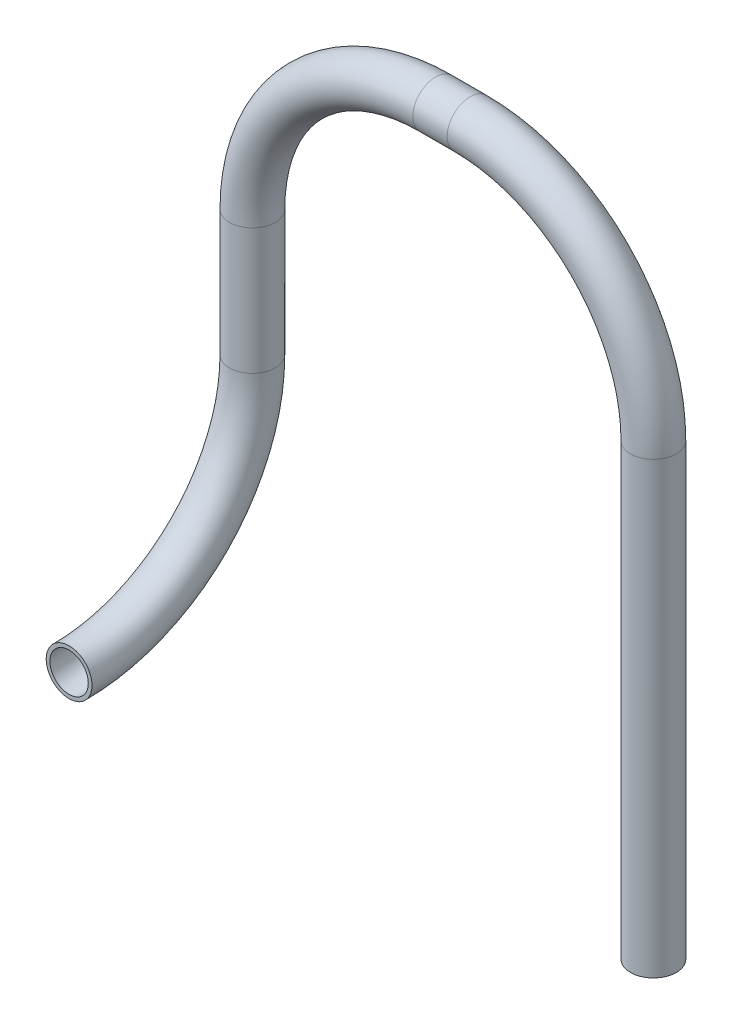
ISO-10303-21;
HEADER;
FILE_DESCRIPTION(('STEP AP214'),'2;1');
FILE_NAME('part.step','',(''),(''),'','','');
FILE_SCHEMA(('AUTOMOTIVE_DESIGN { 1 0 10303 214 1 1 1 1 }'));
ENDSEC;
DATA;
#1=APPLICATION_CONTEXT('core data for automotive mechanical design processes');
#2=APPLICATION_PROTOCOL_DEFINITION('international standard','automotive_design',2000,#1);
#3=PRODUCT_CONTEXT('',#1,'mechanical');
#4=PRODUCT('Part','Part','',(#3));
#5=PRODUCT_RELATED_PRODUCT_CATEGORY('part','',(#4));
#6=PRODUCT_DEFINITION_FORMATION('','',#4);
#7=PRODUCT_DEFINITION_CONTEXT('part definition',#1,'design');
#8=PRODUCT_DEFINITION('design','',#6,#7);
#9=PRODUCT_DEFINITION_SHAPE('','',#8);
#10=(LENGTH_UNIT() NAMED_UNIT(*) SI_UNIT(.MILLI.,.METRE.));
#11=(NAMED_UNIT(*) PLANE_ANGLE_UNIT() SI_UNIT($,.RADIAN.));
#12=(NAMED_UNIT(*) SI_UNIT($,.STERADIAN.) SOLID_ANGLE_UNIT());
#13=UNCERTAINTY_MEASURE_WITH_UNIT(LENGTH_MEASURE(1.E-05),#10,'distance_accuracy_value','');
#14=(GEOMETRIC_REPRESENTATION_CONTEXT(3) GLOBAL_UNCERTAINTY_ASSIGNED_CONTEXT((#13)) GLOBAL_UNIT_ASSIGNED_CONTEXT((#10,
#11,#12)) REPRESENTATION_CONTEXT('',''));
#15=CARTESIAN_POINT('',(0.,0.,0.));
#16=DIRECTION('',(0.,0.,1.));
#17=DIRECTION('',(1.,0.,0.));
#18=AXIS2_PLACEMENT_3D('',#15,#16,#17);
#19=CARTESIAN_POINT('',(70.,-56.4,0.));
#20=DIRECTION('',(0.,-1.,0.));
#21=DIRECTION('',(0.,0.,1.));
#22=AXIS2_PLACEMENT_3D('',#19,#20,#21);
#23=PLANE('',#22);
#24=CARTESIAN_POINT('',(70.,-56.4,0.));
#25=DIRECTION('',(0.,-1.,0.));
#26=DIRECTION('',(1.,0.,0.));
#27=AXIS2_PLACEMENT_3D('',#24,#25,#26);
#28=CIRCLE('',#27,3.35000000000001);
#29=CARTESIAN_POINT('',(73.35,-56.4,0.));
#30=VERTEX_POINT('',#29);
#31=EDGE_CURVE('E60',#30,#30,#28,.T.);
#32=ORIENTED_EDGE('',*,*,#31,.F.);
#33=EDGE_LOOP('',(#32));
#34=FACE_BOUND('',#33,.T.);
#35=CARTESIAN_POINT('',(70.,-56.4,0.));
#36=DIRECTION('',(0.,-1.,0.));
#37=DIRECTION('',(0.,0.,1.));
#38=AXIS2_PLACEMENT_3D('',#35,#36,#37);
#39=CIRCLE('',#38,4.00000000000001);
#40=CARTESIAN_POINT('',(70.,-56.4,4.00000000000001));
#41=VERTEX_POINT('',#40);
#42=EDGE_CURVE('E53',#41,#41,#39,.T.);
#43=ORIENTED_EDGE('',*,*,#42,.T.);
#44=EDGE_LOOP('',(#43));
#45=FACE_BOUND('',#44,.T.);
#46=ADVANCED_FACE('F34',(#34,#45),#23,.T.);
#47=CARTESIAN_POINT('',(70.,-56.4,0.));
#48=DIRECTION('',(0.,1.,0.));
#49=DIRECTION('',(-1.,0.,0.));
#50=AXIS2_PLACEMENT_3D('',#47,#48,#49);
#51=CYLINDRICAL_SURFACE('',#50,4.00000000000001);
#52=CARTESIAN_POINT('',(70.,22.,0.));
#53=DIRECTION('',(0.,-1.,0.));
#54=DIRECTION('',(0.,0.,1.));
#55=AXIS2_PLACEMENT_3D('',#52,#53,#54);
#56=CIRCLE('',#55,4.00000000000001);
#57=CARTESIAN_POINT('',(74.,22.,0.));
#58=VERTEX_POINT('',#57);
#59=EDGE_CURVE('E48',#58,#58,#56,.T.);
#60=ORIENTED_EDGE('',*,*,#59,.T.);
#61=EDGE_LOOP('',(#60));
#62=FACE_BOUND('',#61,.T.);
#63=ORIENTED_EDGE('',*,*,#42,.F.);
#64=EDGE_LOOP('',(#63));
#65=FACE_BOUND('',#64,.T.);
#66=ADVANCED_FACE('F121',(#62,#65),#51,.T.);
#67=CARTESIAN_POINT('',(38.,22.,0.));
#68=DIRECTION('',(0.,0.,1.));
#69=DIRECTION('',(1.,0.,0.));
#70=AXIS2_PLACEMENT_3D('',#67,#68,#69);
#71=TOROIDAL_SURFACE('',#70,32.,4.00000000000001);
#72=CARTESIAN_POINT('',(38.,54.,0.));
#73=DIRECTION('',(1.,0.,0.));
#74=DIRECTION('',(0.,0.,1.));
#75=AXIS2_PLACEMENT_3D('',#72,#73,#74);
#76=CIRCLE('',#75,4.00000000000001);
#77=CARTESIAN_POINT('',(38.,58.,0.));
#78=VERTEX_POINT('',#77);
#79=EDGE_CURVE('E44',#78,#78,#76,.T.);
#80=CARTESIAN_POINT('',(38.,22.,0.));
#81=DIRECTION('',(0.,0.,1.));
#82=DIRECTION('',(1.,0.,0.));
#83=AXIS2_PLACEMENT_3D('',#80,#81,#82);
#84=CIRCLE('',#83,36.);
#85=EDGE_CURVE('',#58,#78,#84,.T.);
#86=ORIENTED_EDGE('',*,*,#59,.F.);
#87=ORIENTED_EDGE('',*,*,#79,.T.);
#88=ORIENTED_EDGE('',*,*,#85,.T.);
#89=ORIENTED_EDGE('',*,*,#85,.F.);
#90=EDGE_LOOP('',(#86,#88,#87,#89));
#91=FACE_BOUND('',#90,.T.);
#92=ADVANCED_FACE('F118',(#91),#71,.T.);
#93=CARTESIAN_POINT('',(38.,54.,0.));
#94=DIRECTION('',(-1.,0.,0.));
#95=DIRECTION('',(0.,0.,1.));
#96=AXIS2_PLACEMENT_3D('',#93,#94,#95);
#97=CYLINDRICAL_SURFACE('',#96,4.00000000000001);
#98=CARTESIAN_POINT('',(32.,54.,0.));
#99=DIRECTION('',(1.,0.,0.));
#100=DIRECTION('',(0.,0.,1.));
#101=AXIS2_PLACEMENT_3D('',#98,#99,#100);
#102=CIRCLE('',#101,4.00000000000001);
#103=CARTESIAN_POINT('',(32.,58.,0.));
#104=VERTEX_POINT('',#103);
#105=EDGE_CURVE('E40',#104,#104,#102,.T.);
#106=ORIENTED_EDGE('',*,*,#105,.T.);
#107=EDGE_LOOP('',(#106));
#108=FACE_BOUND('',#107,.T.);
#109=ORIENTED_EDGE('',*,*,#79,.F.);
#110=EDGE_LOOP('',(#109));
#111=FACE_BOUND('',#110,.T.);
#112=ADVANCED_FACE('F112',(#108,#111),#97,.T.);
#113=CARTESIAN_POINT('',(32.,22.,0.));
#114=DIRECTION('',(0.,0.,1.));
#115=DIRECTION('',(1.,0.,0.));
#116=AXIS2_PLACEMENT_3D('',#113,#114,#115);
#117=TOROIDAL_SURFACE('',#116,32.,4.00000000000001);
#118=CARTESIAN_POINT('',(0.,22.,0.));
#119=DIRECTION('',(0.,1.,0.));
#120=DIRECTION('',(0.,0.,1.));
#121=AXIS2_PLACEMENT_3D('',#118,#119,#120);
#122=CIRCLE('',#121,4.00000000000001);
#123=CARTESIAN_POINT('',(-4.,22.,0.));
#124=VERTEX_POINT('',#123);
#125=EDGE_CURVE('E10',#124,#124,#122,.T.);
#126=CARTESIAN_POINT('',(32.,22.,0.));
#127=DIRECTION('',(0.,0.,1.));
#128=DIRECTION('',(1.,0.,0.));
#129=AXIS2_PLACEMENT_3D('',#126,#127,#128);
#130=CIRCLE('',#129,36.);
#131=EDGE_CURVE('',#104,#124,#130,.T.);
#132=ORIENTED_EDGE('',*,*,#105,.F.);
#133=ORIENTED_EDGE('',*,*,#125,.T.);
#134=ORIENTED_EDGE('',*,*,#131,.T.);
#135=ORIENTED_EDGE('',*,*,#131,.F.);
#136=EDGE_LOOP('',(#132,#134,#133,#135));
#137=FACE_BOUND('',#136,.T.);
#138=ADVANCED_FACE('F103',(#137),#117,.T.);
#139=CARTESIAN_POINT('',(0.,22.,0.));
#140=DIRECTION('',(0.,-1.,0.));
#141=DIRECTION('',(0.,0.,-1.));
#142=AXIS2_PLACEMENT_3D('',#139,#140,#141);
#143=CYLINDRICAL_SURFACE('',#142,4.00000000000001);
#144=CARTESIAN_POINT('',(0.,0.,0.));
#145=DIRECTION('',(0.,1.,0.));
#146=DIRECTION('',(0.,0.,1.));
#147=AXIS2_PLACEMENT_3D('',#144,#145,#146);
#148=CIRCLE('',#147,4.00000000000001);
#149=CARTESIAN_POINT('',(0.,0.,-4.));
#150=VERTEX_POINT('',#149);
#151=EDGE_CURVE('E64',#150,#150,#148,.T.);
#152=ORIENTED_EDGE('',*,*,#151,.T.);
#153=EDGE_LOOP('',(#152));
#154=FACE_BOUND('',#153,.T.);
#155=ORIENTED_EDGE('',*,*,#125,.F.);
#156=EDGE_LOOP('',(#155));
#157=FACE_BOUND('',#156,.T.);
#158=ADVANCED_FACE('F101',(#154,#157),#143,.T.);
#159=CARTESIAN_POINT('',(70.,-56.4,0.));
#160=DIRECTION('',(0.,1.,0.));
#161=DIRECTION('',(-1.,0.,0.));
#162=AXIS2_PLACEMENT_3D('',#159,#160,#161);
#163=CYLINDRICAL_SURFACE('',#162,3.35000000000001);
#164=CARTESIAN_POINT('',(70.,22.,0.));
#165=DIRECTION('',(0.,1.,0.));
#166=DIRECTION('',(-1.,0.,0.));
#167=AXIS2_PLACEMENT_3D('',#164,#165,#166);
#168=CIRCLE('',#167,3.35000000000001);
#169=CARTESIAN_POINT('',(73.35,22.,0.));
#170=VERTEX_POINT('',#169);
#171=EDGE_CURVE('E63',#170,#170,#168,.F.);
#172=ORIENTED_EDGE('',*,*,#171,.F.);
#173=EDGE_LOOP('',(#172));
#174=FACE_BOUND('',#173,.T.);
#175=ORIENTED_EDGE('',*,*,#31,.T.);
#176=EDGE_LOOP('',(#175));
#177=FACE_BOUND('',#176,.T.);
#178=ADVANCED_FACE('F97',(#174,#177),#163,.F.);
#179=CARTESIAN_POINT('',(38.,22.,0.));
#180=DIRECTION('',(0.,0.,1.));
#181=DIRECTION('',(1.,0.,0.));
#182=AXIS2_PLACEMENT_3D('',#179,#180,#181);
#183=TOROIDAL_SURFACE('',#182,32.,3.35000000000001);
#184=CARTESIAN_POINT('',(38.,54.,0.));
#185=DIRECTION('',(1.,0.,0.));
#186=DIRECTION('',(0.,1.,0.));
#187=AXIS2_PLACEMENT_3D('',#184,#185,#186);
#188=CIRCLE('',#187,3.35000000000001);
#189=CARTESIAN_POINT('',(38.,57.35,0.));
#190=VERTEX_POINT('',#189);
#191=EDGE_CURVE('E70',#190,#190,#188,.T.);
#192=CARTESIAN_POINT('',(38.,22.,0.));
#193=DIRECTION('',(0.,0.,1.));
#194=DIRECTION('',(1.,0.,0.));
#195=AXIS2_PLACEMENT_3D('',#192,#193,#194);
#196=CIRCLE('',#195,35.35);
#197=EDGE_CURVE('',#170,#190,#196,.T.);
#198=ORIENTED_EDGE('',*,*,#171,.T.);
#199=ORIENTED_EDGE('',*,*,#191,.F.);
#200=ORIENTED_EDGE('',*,*,#197,.T.);
#201=ORIENTED_EDGE('',*,*,#197,.F.);
#202=EDGE_LOOP('',(#198,#200,#199,#201));
#203=FACE_BOUND('',#202,.T.);
#204=ADVANCED_FACE('F109',(#203),#183,.F.);
#205=CARTESIAN_POINT('',(38.,54.,0.));
#206=DIRECTION('',(-1.,0.,0.));
#207=DIRECTION('',(0.,0.,1.));
#208=AXIS2_PLACEMENT_3D('',#205,#206,#207);
#209=CYLINDRICAL_SURFACE('',#208,3.35000000000001);
#210=CARTESIAN_POINT('',(32.,54.,0.));
#211=DIRECTION('',(-1.,0.,0.));
#212=DIRECTION('',(0.,0.,1.));
#213=AXIS2_PLACEMENT_3D('',#210,#211,#212);
#214=CIRCLE('',#213,3.35000000000001);
#215=CARTESIAN_POINT('',(32.,57.35,0.));
#216=VERTEX_POINT('',#215);
#217=EDGE_CURVE('E67',#216,#216,#214,.F.);
#218=ORIENTED_EDGE('',*,*,#217,.F.);
#219=EDGE_LOOP('',(#218));
#220=FACE_BOUND('',#219,.T.);
#221=ORIENTED_EDGE('',*,*,#191,.T.);
#222=EDGE_LOOP('',(#221));
#223=FACE_BOUND('',#222,.T.);
#224=ADVANCED_FACE('F132',(#220,#223),#209,.F.);
#225=CARTESIAN_POINT('',(32.,22.,0.));
#226=DIRECTION('',(0.,0.,1.));
#227=DIRECTION('',(1.,0.,0.));
#228=AXIS2_PLACEMENT_3D('',#225,#226,#227);
#229=TOROIDAL_SURFACE('',#228,32.,3.35000000000001);
#230=CARTESIAN_POINT('',(0.,22.,0.));
#231=DIRECTION('',(0.,1.,0.));
#232=DIRECTION('',(-1.,0.,0.));
#233=AXIS2_PLACEMENT_3D('',#230,#231,#232);
#234=CIRCLE('',#233,3.35000000000001);
#235=CARTESIAN_POINT('',(-3.35000000000001,22.,0.));
#236=VERTEX_POINT('',#235);
#237=EDGE_CURVE('E59',#236,#236,#234,.T.);
#238=CARTESIAN_POINT('',(32.,22.,0.));
#239=DIRECTION('',(0.,0.,1.));
#240=DIRECTION('',(1.,0.,0.));
#241=AXIS2_PLACEMENT_3D('',#238,#239,#240);
#242=CIRCLE('',#241,35.35);
#243=EDGE_CURVE('',#216,#236,#242,.T.);
#244=ORIENTED_EDGE('',*,*,#217,.T.);
#245=ORIENTED_EDGE('',*,*,#237,.F.);
#246=ORIENTED_EDGE('',*,*,#243,.T.);
#247=ORIENTED_EDGE('',*,*,#243,.F.);
#248=EDGE_LOOP('',(#244,#246,#245,#247));
#249=FACE_BOUND('',#248,.T.);
#250=ADVANCED_FACE('F128',(#249),#229,.F.);
#251=CARTESIAN_POINT('',(0.,22.,0.));
#252=DIRECTION('',(0.,-1.,0.));
#253=DIRECTION('',(0.,0.,-1.));
#254=AXIS2_PLACEMENT_3D('',#251,#252,#253);
#255=CYLINDRICAL_SURFACE('',#254,3.35000000000001);
#256=CARTESIAN_POINT('',(0.,0.,0.));
#257=DIRECTION('',(0.,1.,0.));
#258=DIRECTION('',(0.,0.,1.));
#259=AXIS2_PLACEMENT_3D('',#256,#257,#258);
#260=CIRCLE('',#259,3.35000000000001);
#261=CARTESIAN_POINT('',(0.,0.,-3.35000000000001));
#262=VERTEX_POINT('',#261);
#263=EDGE_CURVE('E56',#262,#262,#260,.T.);
#264=ORIENTED_EDGE('',*,*,#263,.F.);
#265=EDGE_LOOP('',(#264));
#266=FACE_BOUND('',#265,.T.);
#267=ORIENTED_EDGE('',*,*,#237,.T.);
#268=EDGE_LOOP('',(#267));
#269=FACE_BOUND('',#268,.T.);
#270=ADVANCED_FACE('F99',(#266,#269),#255,.F.);
#271=CARTESIAN_POINT('',(0.,-32.0000000000001,31.9999999999999));
#272=DIRECTION('',(0.,0.,-1.));
#273=DIRECTION('',(0.,1.,0.));
#274=AXIS2_PLACEMENT_3D('',#271,#272,#273);
#275=PLANE('',#274);
#276=CARTESIAN_POINT('',(0.,-32.0000000000001,32.));
#277=DIRECTION('',(0.,0.,-1.));
#278=DIRECTION('',(0.,1.,0.));
#279=AXIS2_PLACEMENT_3D('',#276,#277,#278);
#280=CIRCLE('',#279,3.35000000000001);
#281=CARTESIAN_POINT('',(0.,-35.3500000000001,32.));
#282=VERTEX_POINT('',#281);
#283=EDGE_CURVE('E80',#282,#282,#280,.T.);
#284=ORIENTED_EDGE('',*,*,#283,.T.);
#285=EDGE_LOOP('',(#284));
#286=FACE_BOUND('',#285,.T.);
#287=CARTESIAN_POINT('',(0.,-32.0000000000001,31.9999999999999));
#288=DIRECTION('',(0.,0.,-1.));
#289=DIRECTION('',(0.,1.,0.));
#290=AXIS2_PLACEMENT_3D('',#287,#288,#289);
#291=CIRCLE('',#290,4.00000000000001);
#292=CARTESIAN_POINT('',(0.,-36.0000000000001,31.9999999999999));
#293=VERTEX_POINT('',#292);
#294=EDGE_CURVE('E77',#293,#293,#291,.T.);
#295=ORIENTED_EDGE('',*,*,#294,.F.);
#296=EDGE_LOOP('',(#295));
#297=FACE_BOUND('',#296,.T.);
#298=ADVANCED_FACE('F84',(#286,#297),#275,.F.);
#299=CARTESIAN_POINT('',(0.,-1.2490009027033E-13,32.));
#300=DIRECTION('',(1.,0.,0.));
#301=DIRECTION('',(0.,0.,-1.));
#302=AXIS2_PLACEMENT_3D('',#299,#300,#301);
#303=TOROIDAL_SURFACE('',#302,32.,4.00000000000001);
#304=CARTESIAN_POINT('',(0.,-1.2490009027033E-13,32.));
#305=DIRECTION('',(1.,0.,0.));
#306=DIRECTION('',(0.,0.,-1.));
#307=AXIS2_PLACEMENT_3D('',#304,#305,#306);
#308=CIRCLE('',#307,36.);
#309=EDGE_CURVE('',#293,#150,#308,.T.);
#310=ORIENTED_EDGE('',*,*,#294,.T.);
#311=ORIENTED_EDGE('',*,*,#151,.F.);
#312=ORIENTED_EDGE('',*,*,#309,.T.);
#313=ORIENTED_EDGE('',*,*,#309,.F.);
#314=EDGE_LOOP('',(#310,#312,#311,#313));
#315=FACE_BOUND('',#314,.T.);
#316=ADVANCED_FACE('F89',(#315),#303,.T.);
#317=CARTESIAN_POINT('',(0.,-1.2490009027033E-13,32.));
#318=DIRECTION('',(1.,0.,0.));
#319=DIRECTION('',(0.,0.,-1.));
#320=AXIS2_PLACEMENT_3D('',#317,#318,#319);
#321=TOROIDAL_SURFACE('',#320,32.,3.35000000000001);
#322=CARTESIAN_POINT('',(0.,-1.2490009027033E-13,32.));
#323=DIRECTION('',(1.,0.,0.));
#324=DIRECTION('',(0.,0.,-1.));
#325=AXIS2_PLACEMENT_3D('',#322,#323,#324);
#326=CIRCLE('',#325,35.35);
#327=EDGE_CURVE('',#282,#262,#326,.T.);
#328=ORIENTED_EDGE('',*,*,#283,.F.);
#329=ORIENTED_EDGE('',*,*,#263,.T.);
#330=ORIENTED_EDGE('',*,*,#327,.T.);
#331=ORIENTED_EDGE('',*,*,#327,.F.);
#332=EDGE_LOOP('',(#328,#330,#329,#331));
#333=FACE_BOUND('',#332,.T.);
#334=ADVANCED_FACE('F87',(#333),#321,.F.);
#335=CLOSED_SHELL('',(#46,#66,#92,#112,#138,#158,#178,#204,#224,#250,#270,#298,#316,#334));
#336=MANIFOLD_SOLID_BREP('B2',#335);
#337=ADVANCED_BREP_SHAPE_REPRESENTATION('',(#18,#336),#14);
#338=SHAPE_DEFINITION_REPRESENTATION(#9,#337);
ENDSEC;
END-ISO-10303-21;
